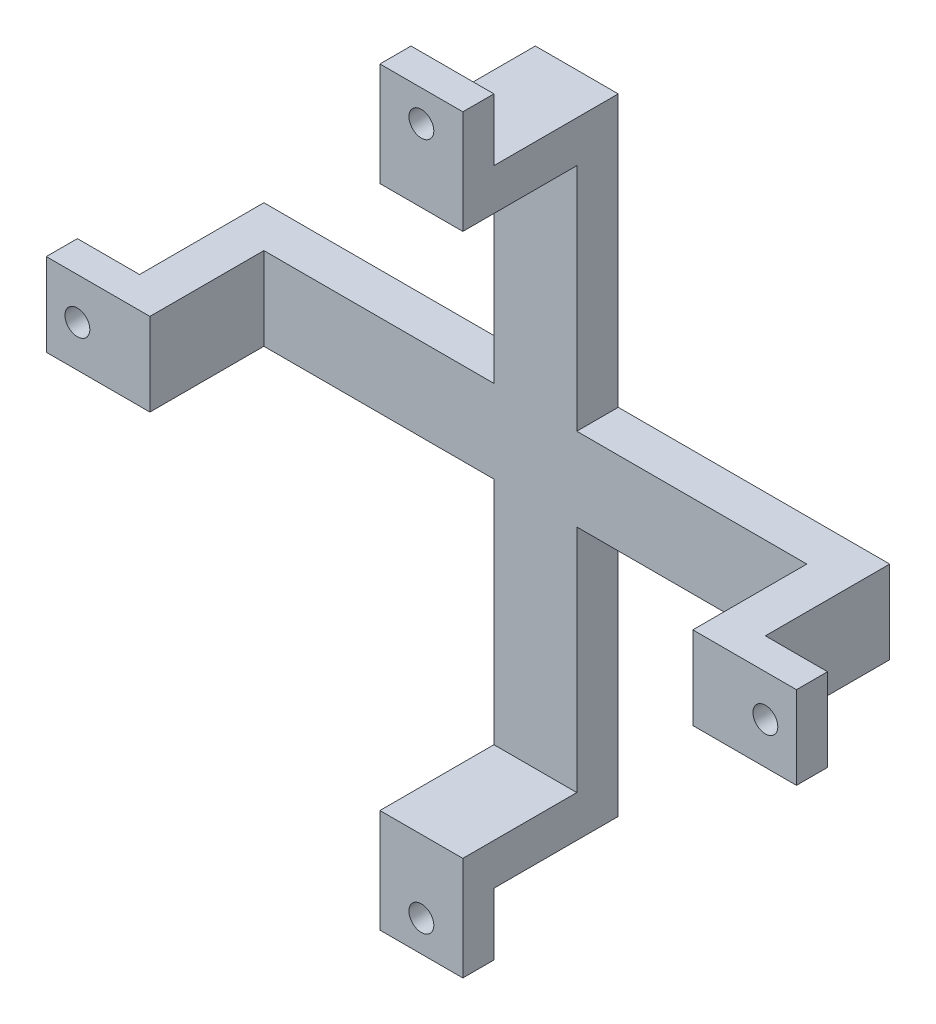
ISO-10303-21;
HEADER;
FILE_DESCRIPTION(('STEP AP214'),'2;1');
FILE_NAME('part.step','',(''),(''),'','','');
FILE_SCHEMA(('AUTOMOTIVE_DESIGN { 1 0 10303 214 1 1 1 1 }'));
ENDSEC;
DATA;
#1=APPLICATION_CONTEXT('core data for automotive mechanical design processes');
#2=APPLICATION_PROTOCOL_DEFINITION('international standard','automotive_design',2000,#1);
#3=PRODUCT_CONTEXT('',#1,'mechanical');
#4=PRODUCT('Part','Part','',(#3));
#5=PRODUCT_RELATED_PRODUCT_CATEGORY('part','',(#4));
#6=PRODUCT_DEFINITION_FORMATION('','',#4);
#7=PRODUCT_DEFINITION_CONTEXT('part definition',#1,'design');
#8=PRODUCT_DEFINITION('design','',#6,#7);
#9=PRODUCT_DEFINITION_SHAPE('','',#8);
#10=(LENGTH_UNIT() NAMED_UNIT(*) SI_UNIT(.MILLI.,.METRE.));
#11=(NAMED_UNIT(*) PLANE_ANGLE_UNIT() SI_UNIT($,.RADIAN.));
#12=(NAMED_UNIT(*) SI_UNIT($,.STERADIAN.) SOLID_ANGLE_UNIT());
#13=UNCERTAINTY_MEASURE_WITH_UNIT(LENGTH_MEASURE(1.E-05),#10,'distance_accuracy_value','');
#14=(GEOMETRIC_REPRESENTATION_CONTEXT(3) GLOBAL_UNCERTAINTY_ASSIGNED_CONTEXT((#13)) GLOBAL_UNIT_ASSIGNED_CONTEXT((#10,
#11,#12)) REPRESENTATION_CONTEXT('',''));
#15=CARTESIAN_POINT('',(0.,0.,0.));
#16=DIRECTION('',(0.,0.,1.));
#17=DIRECTION('',(1.,0.,0.));
#18=AXIS2_PLACEMENT_3D('',#15,#16,#17);
#19=CARTESIAN_POINT('',(-13.1,2.,2.));
#20=DIRECTION('',(0.,1.,0.));
#21=DIRECTION('',(0.,0.,1.));
#22=AXIS2_PLACEMENT_3D('',#19,#20,#21);
#23=PLANE('',#22);
#24=DIRECTION('',(0.,0.,-1.));
#25=VECTOR('',#24,1.);
#26=CARTESIAN_POINT('',(2.,2.,2.));
#27=LINE('',#26,#25);
#28=CARTESIAN_POINT('',(2.,2.,2.));
#29=VERTEX_POINT('',#28);
#30=CARTESIAN_POINT('',(2.,2.,0.));
#31=VERTEX_POINT('',#30);
#32=EDGE_CURVE('E509',#29,#31,#27,.T.);
#33=ORIENTED_EDGE('',*,*,#32,.F.);
#34=DIRECTION('',(1.,0.,0.));
#35=VECTOR('',#34,1.);
#36=CARTESIAN_POINT('',(-13.1,2.,2.));
#37=LINE('',#36,#35);
#38=CARTESIAN_POINT('',(13.1,2.,2.));
#39=VERTEX_POINT('',#38);
#40=EDGE_CURVE('E505',#29,#39,#37,.T.);
#41=ORIENTED_EDGE('',*,*,#40,.T.);
#42=DIRECTION('',(0.,0.,-1.));
#43=VECTOR('',#42,1.);
#44=CARTESIAN_POINT('',(13.1,2.,7.5));
#45=LINE('',#44,#43);
#46=CARTESIAN_POINT('',(13.1,2.,7.5));
#47=VERTEX_POINT('',#46);
#48=EDGE_CURVE('E488',#47,#39,#45,.T.);
#49=ORIENTED_EDGE('',*,*,#48,.F.);
#50=DIRECTION('',(1.,0.,0.));
#51=VECTOR('',#50,1.);
#52=CARTESIAN_POINT('',(0.,2.,7.5));
#53=LINE('',#52,#51);
#54=CARTESIAN_POINT('',(18.1,2.,7.5));
#55=VERTEX_POINT('',#54);
#56=EDGE_CURVE('E475',#47,#55,#53,.T.);
#57=ORIENTED_EDGE('',*,*,#56,.T.);
#58=DIRECTION('',(0.,0.,1.));
#59=VECTOR('',#58,1.);
#60=CARTESIAN_POINT('',(18.1,2.,6.));
#61=LINE('',#60,#59);
#62=CARTESIAN_POINT('',(18.1,2.,6.));
#63=VERTEX_POINT('',#62);
#64=EDGE_CURVE('E365',#63,#55,#61,.T.);
#65=ORIENTED_EDGE('',*,*,#64,.F.);
#66=DIRECTION('',(-1.,0.,0.));
#67=VECTOR('',#66,1.);
#68=CARTESIAN_POINT('',(0.,2.,6.));
#69=LINE('',#68,#67);
#70=CARTESIAN_POINT('',(15.1,2.,6.));
#71=VERTEX_POINT('',#70);
#72=EDGE_CURVE('E354',#63,#71,#69,.T.);
#73=ORIENTED_EDGE('',*,*,#72,.T.);
#74=DIRECTION('',(0.,0.,-1.));
#75=VECTOR('',#74,1.);
#76=CARTESIAN_POINT('',(15.1,2.,7.5));
#77=LINE('',#76,#75);
#78=CARTESIAN_POINT('',(15.1,2.,0.));
#79=VERTEX_POINT('',#78);
#80=EDGE_CURVE('E491',#71,#79,#77,.T.);
#81=ORIENTED_EDGE('',*,*,#80,.T.);
#82=DIRECTION('',(1.,0.,0.));
#83=VECTOR('',#82,1.);
#84=CARTESIAN_POINT('',(-13.1,2.,0.));
#85=LINE('',#84,#83);
#86=EDGE_CURVE('E513',#31,#79,#85,.T.);
#87=ORIENTED_EDGE('',*,*,#86,.F.);
#88=EDGE_LOOP('',(#33,#41,#49,#57,#65,#73,#81,#87));
#89=FACE_BOUND('',#88,.T.);
#90=ADVANCED_FACE('F122',(#89),#23,.T.);
#91=CARTESIAN_POINT('',(-13.1,-2.,2.));
#92=DIRECTION('',(0.,1.,0.));
#93=DIRECTION('',(0.,0.,1.));
#94=AXIS2_PLACEMENT_3D('',#91,#92,#93);
#95=PLANE('',#94);
#96=DIRECTION('',(1.,0.,0.));
#97=VECTOR('',#96,1.);
#98=CARTESIAN_POINT('',(-13.1,-2.,2.));
#99=LINE('',#98,#97);
#100=CARTESIAN_POINT('',(2.,-2.,2.));
#101=VERTEX_POINT('',#100);
#102=CARTESIAN_POINT('',(13.1,-2.,2.));
#103=VERTEX_POINT('',#102);
#104=EDGE_CURVE('E497',#101,#103,#99,.T.);
#105=ORIENTED_EDGE('',*,*,#104,.F.);
#106=DIRECTION('',(0.,0.,-1.));
#107=VECTOR('',#106,1.);
#108=CARTESIAN_POINT('',(2.,-2.,2.));
#109=LINE('',#108,#107);
#110=CARTESIAN_POINT('',(2.,-2.,0.));
#111=VERTEX_POINT('',#110);
#112=EDGE_CURVE('E130',#101,#111,#109,.T.);
#113=ORIENTED_EDGE('',*,*,#112,.T.);
#114=DIRECTION('',(1.,0.,0.));
#115=VECTOR('',#114,1.);
#116=CARTESIAN_POINT('',(-13.1,-2.,0.));
#117=LINE('',#116,#115);
#118=CARTESIAN_POINT('',(15.1,-2.,0.));
#119=VERTEX_POINT('',#118);
#120=EDGE_CURVE('E514',#111,#119,#117,.T.);
#121=ORIENTED_EDGE('',*,*,#120,.T.);
#122=DIRECTION('',(0.,0.,-1.));
#123=VECTOR('',#122,1.);
#124=CARTESIAN_POINT('',(15.1,-2.,7.5));
#125=LINE('',#124,#123);
#126=CARTESIAN_POINT('',(15.1,-2.,6.));
#127=VERTEX_POINT('',#126);
#128=EDGE_CURVE('E481',#127,#119,#125,.T.);
#129=ORIENTED_EDGE('',*,*,#128,.F.);
#130=DIRECTION('',(-1.,0.,0.));
#131=VECTOR('',#130,1.);
#132=CARTESIAN_POINT('',(0.,-2.,6.));
#133=LINE('',#132,#131);
#134=CARTESIAN_POINT('',(18.1,-2.,6.));
#135=VERTEX_POINT('',#134);
#136=EDGE_CURVE('E350',#135,#127,#133,.T.);
#137=ORIENTED_EDGE('',*,*,#136,.F.);
#138=DIRECTION('',(0.,0.,1.));
#139=VECTOR('',#138,1.);
#140=CARTESIAN_POINT('',(18.1,-2.,6.));
#141=LINE('',#140,#139);
#142=CARTESIAN_POINT('',(18.1,-2.,7.5));
#143=VERTEX_POINT('',#142);
#144=EDGE_CURVE('E360',#135,#143,#141,.T.);
#145=ORIENTED_EDGE('',*,*,#144,.T.);
#146=DIRECTION('',(1.,0.,0.));
#147=VECTOR('',#146,1.);
#148=CARTESIAN_POINT('',(0.,-2.,7.5));
#149=LINE('',#148,#147);
#150=CARTESIAN_POINT('',(13.1,-2.,7.5));
#151=VERTEX_POINT('',#150);
#152=EDGE_CURVE('E479',#151,#143,#149,.T.);
#153=ORIENTED_EDGE('',*,*,#152,.F.);
#154=DIRECTION('',(0.,0.,-1.));
#155=VECTOR('',#154,1.);
#156=CARTESIAN_POINT('',(13.1,-2.,7.5));
#157=LINE('',#156,#155);
#158=EDGE_CURVE('E485',#151,#103,#157,.T.);
#159=ORIENTED_EDGE('',*,*,#158,.T.);
#160=EDGE_LOOP('',(#105,#113,#121,#129,#137,#145,#153,#159));
#161=FACE_BOUND('',#160,.T.);
#162=ADVANCED_FACE('F600',(#161),#95,.F.);
#163=CARTESIAN_POINT('',(0.,0.,0.));
#164=DIRECTION('',(0.,0.,1.));
#165=DIRECTION('',(1.,0.,0.));
#166=AXIS2_PLACEMENT_3D('',#163,#164,#165);
#167=PLANE('',#166);
#168=ORIENTED_EDGE('',*,*,#120,.F.);
#169=DIRECTION('',(0.,-1.,0.));
#170=VECTOR('',#169,1.);
#171=CARTESIAN_POINT('',(2.,13.1,0.));
#172=LINE('',#171,#170);
#173=CARTESIAN_POINT('',(2.,-15.1,0.));
#174=VERTEX_POINT('',#173);
#175=EDGE_CURVE('E533',#111,#174,#172,.T.);
#176=ORIENTED_EDGE('',*,*,#175,.T.);
#177=DIRECTION('',(-1.,0.,0.));
#178=VECTOR('',#177,1.);
#179=CARTESIAN_POINT('',(0.,-15.1,0.));
#180=LINE('',#179,#178);
#181=CARTESIAN_POINT('',(-2.,-15.1,0.));
#182=VERTEX_POINT('',#181);
#183=EDGE_CURVE('E441',#174,#182,#180,.T.);
#184=ORIENTED_EDGE('',*,*,#183,.T.);
#185=DIRECTION('',(0.,-1.,0.));
#186=VECTOR('',#185,1.);
#187=CARTESIAN_POINT('',(-2.,13.1,0.));
#188=LINE('',#187,#186);
#189=CARTESIAN_POINT('',(-2.,-2.,0.));
#190=VERTEX_POINT('',#189);
#191=EDGE_CURVE('E493',#190,#182,#188,.T.);
#192=ORIENTED_EDGE('',*,*,#191,.F.);
#193=CARTESIAN_POINT('',(-15.1,-2.,0.));
#194=VERTEX_POINT('',#193);
#195=EDGE_CURVE('E510',#194,#190,#117,.T.);
#196=ORIENTED_EDGE('',*,*,#195,.F.);
#197=DIRECTION('',(0.,1.,0.));
#198=VECTOR('',#197,1.);
#199=CARTESIAN_POINT('',(-15.1,0.,0.));
#200=LINE('',#199,#198);
#201=CARTESIAN_POINT('',(-15.1,2.,0.));
#202=VERTEX_POINT('',#201);
#203=EDGE_CURVE('E422',#194,#202,#200,.T.);
#204=ORIENTED_EDGE('',*,*,#203,.T.);
#205=CARTESIAN_POINT('',(-2.,2.,0.));
#206=VERTEX_POINT('',#205);
#207=EDGE_CURVE('E498',#202,#206,#85,.T.);
#208=ORIENTED_EDGE('',*,*,#207,.T.);
#209=CARTESIAN_POINT('',(-2.,15.1,0.));
#210=VERTEX_POINT('',#209);
#211=EDGE_CURVE('E531',#210,#206,#188,.T.);
#212=ORIENTED_EDGE('',*,*,#211,.F.);
#213=DIRECTION('',(1.,0.,0.));
#214=VECTOR('',#213,1.);
#215=CARTESIAN_POINT('',(0.,15.1,0.));
#216=LINE('',#215,#214);
#217=CARTESIAN_POINT('',(2.,15.1,0.));
#218=VERTEX_POINT('',#217);
#219=EDGE_CURVE('E307',#210,#218,#216,.T.);
#220=ORIENTED_EDGE('',*,*,#219,.T.);
#221=EDGE_CURVE('E534',#218,#31,#172,.T.);
#222=ORIENTED_EDGE('',*,*,#221,.T.);
#223=ORIENTED_EDGE('',*,*,#86,.T.);
#224=DIRECTION('',(0.,-1.,0.));
#225=VECTOR('',#224,1.);
#226=CARTESIAN_POINT('',(15.1,0.,0.));
#227=LINE('',#226,#225);
#228=EDGE_CURVE('E474',#79,#119,#227,.T.);
#229=ORIENTED_EDGE('',*,*,#228,.T.);
#230=EDGE_LOOP('',(#168,#176,#184,#192,#196,#204,#208,#212,#220,#222,#223,#229));
#231=FACE_BOUND('',#230,.T.);
#232=ADVANCED_FACE('F546',(#231),#167,.F.);
#233=CARTESIAN_POINT('',(0.,0.,2.));
#234=DIRECTION('',(0.,0.,1.));
#235=DIRECTION('',(1.,0.,0.));
#236=AXIS2_PLACEMENT_3D('',#233,#234,#235);
#237=PLANE('',#236);
#238=ORIENTED_EDGE('',*,*,#40,.F.);
#239=DIRECTION('',(0.,-1.,0.));
#240=VECTOR('',#239,1.);
#241=CARTESIAN_POINT('',(2.,13.1,2.));
#242=LINE('',#241,#240);
#243=CARTESIAN_POINT('',(2.,13.1,2.));
#244=VERTEX_POINT('',#243);
#245=EDGE_CURVE('E525',#244,#29,#242,.T.);
#246=ORIENTED_EDGE('',*,*,#245,.F.);
#247=DIRECTION('',(1.,0.,0.));
#248=VECTOR('',#247,1.);
#249=CARTESIAN_POINT('',(-2.,13.1,2.));
#250=LINE('',#249,#248);
#251=CARTESIAN_POINT('',(-2.,13.1,2.));
#252=VERTEX_POINT('',#251);
#253=EDGE_CURVE('E528',#252,#244,#250,.T.);
#254=ORIENTED_EDGE('',*,*,#253,.F.);
#255=DIRECTION('',(0.,-1.,0.));
#256=VECTOR('',#255,1.);
#257=CARTESIAN_POINT('',(-2.,13.1,2.));
#258=LINE('',#257,#256);
#259=CARTESIAN_POINT('',(-2.,2.,2.));
#260=VERTEX_POINT('',#259);
#261=EDGE_CURVE('E517',#252,#260,#258,.T.);
#262=ORIENTED_EDGE('',*,*,#261,.T.);
#263=CARTESIAN_POINT('',(-13.1,2.,2.));
#264=VERTEX_POINT('',#263);
#265=EDGE_CURVE('E506',#264,#260,#37,.T.);
#266=ORIENTED_EDGE('',*,*,#265,.F.);
#267=DIRECTION('',(0.,-1.,0.));
#268=VECTOR('',#267,1.);
#269=CARTESIAN_POINT('',(-13.1,2.,2.));
#270=LINE('',#269,#268);
#271=CARTESIAN_POINT('',(-13.1,-2.,2.));
#272=VERTEX_POINT('',#271);
#273=EDGE_CURVE('E494',#264,#272,#270,.T.);
#274=ORIENTED_EDGE('',*,*,#273,.T.);
#275=CARTESIAN_POINT('',(-2.,-2.,2.));
#276=VERTEX_POINT('',#275);
#277=EDGE_CURVE('E499',#272,#276,#99,.T.);
#278=ORIENTED_EDGE('',*,*,#277,.T.);
#279=CARTESIAN_POINT('',(-2.,-13.1,2.));
#280=VERTEX_POINT('',#279);
#281=EDGE_CURVE('E521',#276,#280,#258,.T.);
#282=ORIENTED_EDGE('',*,*,#281,.T.);
#283=DIRECTION('',(1.,0.,0.));
#284=VECTOR('',#283,1.);
#285=CARTESIAN_POINT('',(-2.,-13.1,2.));
#286=LINE('',#285,#284);
#287=CARTESIAN_POINT('',(2.,-13.1,2.));
#288=VERTEX_POINT('',#287);
#289=EDGE_CURVE('E520',#280,#288,#286,.T.);
#290=ORIENTED_EDGE('',*,*,#289,.T.);
#291=EDGE_CURVE('E524',#101,#288,#242,.T.);
#292=ORIENTED_EDGE('',*,*,#291,.F.);
#293=ORIENTED_EDGE('',*,*,#104,.T.);
#294=DIRECTION('',(0.,-1.,0.));
#295=VECTOR('',#294,1.);
#296=CARTESIAN_POINT('',(13.1,2.,2.));
#297=LINE('',#296,#295);
#298=EDGE_CURVE('E502',#39,#103,#297,.T.);
#299=ORIENTED_EDGE('',*,*,#298,.F.);
#300=EDGE_LOOP('',(#238,#246,#254,#262,#266,#274,#278,#282,#290,#292,#293,#299));
#301=FACE_BOUND('',#300,.T.);
#302=ADVANCED_FACE('F571',(#301),#237,.T.);
#303=ORIENTED_EDGE('',*,*,#265,.T.);
#304=DIRECTION('',(0.,0.,-1.));
#305=VECTOR('',#304,1.);
#306=CARTESIAN_POINT('',(-2.,2.,2.));
#307=LINE('',#306,#305);
#308=EDGE_CURVE('E538',#260,#206,#307,.T.);
#309=ORIENTED_EDGE('',*,*,#308,.T.);
#310=ORIENTED_EDGE('',*,*,#207,.F.);
#311=DIRECTION('',(0.,0.,-1.));
#312=VECTOR('',#311,1.);
#313=CARTESIAN_POINT('',(-15.1,2.,7.5));
#314=LINE('',#313,#312);
#315=CARTESIAN_POINT('',(-15.1,2.,6.));
#316=VERTEX_POINT('',#315);
#317=EDGE_CURVE('E430',#316,#202,#314,.T.);
#318=ORIENTED_EDGE('',*,*,#317,.F.);
#319=DIRECTION('',(1.,0.,0.));
#320=VECTOR('',#319,1.);
#321=CARTESIAN_POINT('',(0.,1.99999999999999,6.));
#322=LINE('',#321,#320);
#323=CARTESIAN_POINT('',(-18.1,2.,6.));
#324=VERTEX_POINT('',#323);
#325=EDGE_CURVE('E402',#324,#316,#322,.T.);
#326=ORIENTED_EDGE('',*,*,#325,.F.);
#327=DIRECTION('',(0.,0.,1.));
#328=VECTOR('',#327,1.);
#329=CARTESIAN_POINT('',(-18.1,2.,6.));
#330=LINE('',#329,#328);
#331=CARTESIAN_POINT('',(-18.1,2.,7.5));
#332=VERTEX_POINT('',#331);
#333=EDGE_CURVE('E414',#324,#332,#330,.T.);
#334=ORIENTED_EDGE('',*,*,#333,.T.);
#335=DIRECTION('',(-1.,0.,0.));
#336=VECTOR('',#335,1.);
#337=CARTESIAN_POINT('',(0.,2.00000000000002,7.5));
#338=LINE('',#337,#336);
#339=CARTESIAN_POINT('',(-13.1,2.,7.5));
#340=VERTEX_POINT('',#339);
#341=EDGE_CURVE('E428',#340,#332,#338,.T.);
#342=ORIENTED_EDGE('',*,*,#341,.F.);
#343=DIRECTION('',(0.,0.,-1.));
#344=VECTOR('',#343,1.);
#345=CARTESIAN_POINT('',(-13.1,2.,7.5));
#346=LINE('',#345,#344);
#347=EDGE_CURVE('E434',#340,#264,#346,.T.);
#348=ORIENTED_EDGE('',*,*,#347,.T.);
#349=EDGE_LOOP('',(#303,#309,#310,#318,#326,#334,#342,#348));
#350=FACE_BOUND('',#349,.T.);
#351=ADVANCED_FACE('F541',(#350),#23,.T.);
#352=DIRECTION('',(0.,0.,-1.));
#353=VECTOR('',#352,1.);
#354=CARTESIAN_POINT('',(-2.,-2.,2.));
#355=LINE('',#354,#353);
#356=EDGE_CURVE('E12',#276,#190,#355,.T.);
#357=ORIENTED_EDGE('',*,*,#356,.F.);
#358=ORIENTED_EDGE('',*,*,#277,.F.);
#359=DIRECTION('',(0.,0.,-1.));
#360=VECTOR('',#359,1.);
#361=CARTESIAN_POINT('',(-13.1,-2.,7.5));
#362=LINE('',#361,#360);
#363=CARTESIAN_POINT('',(-13.1,-2.,7.5));
#364=VERTEX_POINT('',#363);
#365=EDGE_CURVE('E437',#364,#272,#362,.T.);
#366=ORIENTED_EDGE('',*,*,#365,.F.);
#367=DIRECTION('',(-1.,0.,0.));
#368=VECTOR('',#367,1.);
#369=CARTESIAN_POINT('',(0.,-2.00000000000002,7.5));
#370=LINE('',#369,#368);
#371=CARTESIAN_POINT('',(-18.1,-2.,7.5));
#372=VERTEX_POINT('',#371);
#373=EDGE_CURVE('E423',#364,#372,#370,.T.);
#374=ORIENTED_EDGE('',*,*,#373,.T.);
#375=DIRECTION('',(0.,0.,1.));
#376=VECTOR('',#375,1.);
#377=CARTESIAN_POINT('',(-18.1,-2.,6.));
#378=LINE('',#377,#376);
#379=CARTESIAN_POINT('',(-18.1,-2.,6.));
#380=VERTEX_POINT('',#379);
#381=EDGE_CURVE('E419',#380,#372,#378,.T.);
#382=ORIENTED_EDGE('',*,*,#381,.F.);
#383=DIRECTION('',(1.,0.,0.));
#384=VECTOR('',#383,1.);
#385=CARTESIAN_POINT('',(0.,-1.99999999999999,6.));
#386=LINE('',#385,#384);
#387=CARTESIAN_POINT('',(-15.1,-2.,6.));
#388=VERTEX_POINT('',#387);
#389=EDGE_CURVE('E408',#380,#388,#386,.T.);
#390=ORIENTED_EDGE('',*,*,#389,.T.);
#391=DIRECTION('',(0.,0.,-1.));
#392=VECTOR('',#391,1.);
#393=CARTESIAN_POINT('',(-15.1,-2.,7.5));
#394=LINE('',#393,#392);
#395=EDGE_CURVE('E439',#388,#194,#394,.T.);
#396=ORIENTED_EDGE('',*,*,#395,.T.);
#397=ORIENTED_EDGE('',*,*,#195,.T.);
#398=EDGE_LOOP('',(#357,#358,#366,#374,#382,#390,#396,#397));
#399=FACE_BOUND('',#398,.T.);
#400=ADVANCED_FACE('F617',(#399),#95,.F.);
#401=CARTESIAN_POINT('',(2.,13.1,2.));
#402=DIRECTION('',(1.,0.,0.));
#403=DIRECTION('',(0.,1.,0.));
#404=AXIS2_PLACEMENT_3D('',#401,#402,#403);
#405=PLANE('',#404);
#406=ORIENTED_EDGE('',*,*,#245,.T.);
#407=ORIENTED_EDGE('',*,*,#32,.T.);
#408=ORIENTED_EDGE('',*,*,#221,.F.);
#409=DIRECTION('',(0.,0.,-1.));
#410=VECTOR('',#409,1.);
#411=CARTESIAN_POINT('',(2.,15.1,7.5));
#412=LINE('',#411,#410);
#413=CARTESIAN_POINT('',(2.,15.1,6.));
#414=VERTEX_POINT('',#413);
#415=EDGE_CURVE('E312',#414,#218,#412,.T.);
#416=ORIENTED_EDGE('',*,*,#415,.F.);
#417=DIRECTION('',(0.,-1.,0.));
#418=VECTOR('',#417,1.);
#419=CARTESIAN_POINT('',(2.,0.,6.));
#420=LINE('',#419,#418);
#421=CARTESIAN_POINT('',(2.,18.1,6.));
#422=VERTEX_POINT('',#421);
#423=EDGE_CURVE('E323',#422,#414,#420,.T.);
#424=ORIENTED_EDGE('',*,*,#423,.F.);
#425=DIRECTION('',(0.,0.,1.));
#426=VECTOR('',#425,1.);
#427=CARTESIAN_POINT('',(2.,18.1,6.));
#428=LINE('',#427,#426);
#429=CARTESIAN_POINT('',(2.,18.1,7.5));
#430=VERTEX_POINT('',#429);
#431=EDGE_CURVE('E338',#422,#430,#428,.T.);
#432=ORIENTED_EDGE('',*,*,#431,.T.);
#433=DIRECTION('',(0.,1.,0.));
#434=VECTOR('',#433,1.);
#435=CARTESIAN_POINT('',(2.,0.,7.5));
#436=LINE('',#435,#434);
#437=CARTESIAN_POINT('',(2.,13.1,7.5));
#438=VERTEX_POINT('',#437);
#439=EDGE_CURVE('E463',#438,#430,#436,.T.);
#440=ORIENTED_EDGE('',*,*,#439,.F.);
#441=DIRECTION('',(0.,0.,-1.));
#442=VECTOR('',#441,1.);
#443=CARTESIAN_POINT('',(2.,13.1,7.5));
#444=LINE('',#443,#442);
#445=EDGE_CURVE('E471',#438,#244,#444,.T.);
#446=ORIENTED_EDGE('',*,*,#445,.T.);
#447=EDGE_LOOP('',(#406,#407,#408,#416,#424,#432,#440,#446));
#448=FACE_BOUND('',#447,.T.);
#449=ADVANCED_FACE('F586',(#448),#405,.T.);
#450=CARTESIAN_POINT('',(-2.,13.1,2.));
#451=DIRECTION('',(1.,0.,0.));
#452=DIRECTION('',(0.,1.,0.));
#453=AXIS2_PLACEMENT_3D('',#450,#451,#452);
#454=PLANE('',#453);
#455=ORIENTED_EDGE('',*,*,#308,.F.);
#456=ORIENTED_EDGE('',*,*,#261,.F.);
#457=DIRECTION('',(0.,0.,-1.));
#458=VECTOR('',#457,1.);
#459=CARTESIAN_POINT('',(-2.,13.1,7.5));
#460=LINE('',#459,#458);
#461=CARTESIAN_POINT('',(-2.,13.1,7.5));
#462=VERTEX_POINT('',#461);
#463=EDGE_CURVE('E313',#462,#252,#460,.T.);
#464=ORIENTED_EDGE('',*,*,#463,.F.);
#465=DIRECTION('',(0.,1.,0.));
#466=VECTOR('',#465,1.);
#467=CARTESIAN_POINT('',(-2.,0.,7.5));
#468=LINE('',#467,#466);
#469=CARTESIAN_POINT('',(-2.,18.1,7.5));
#470=VERTEX_POINT('',#469);
#471=EDGE_CURVE('E465',#462,#470,#468,.T.);
#472=ORIENTED_EDGE('',*,*,#471,.T.);
#473=DIRECTION('',(0.,0.,1.));
#474=VECTOR('',#473,1.);
#475=CARTESIAN_POINT('',(-2.,18.1,6.));
#476=LINE('',#475,#474);
#477=CARTESIAN_POINT('',(-2.,18.1,6.));
#478=VERTEX_POINT('',#477);
#479=EDGE_CURVE('E326',#478,#470,#476,.T.);
#480=ORIENTED_EDGE('',*,*,#479,.F.);
#481=DIRECTION('',(0.,-1.,0.));
#482=VECTOR('',#481,1.);
#483=CARTESIAN_POINT('',(-2.,0.,6.));
#484=LINE('',#483,#482);
#485=CARTESIAN_POINT('',(-2.,15.1,6.));
#486=VERTEX_POINT('',#485);
#487=EDGE_CURVE('E320',#478,#486,#484,.T.);
#488=ORIENTED_EDGE('',*,*,#487,.T.);
#489=DIRECTION('',(0.,0.,-1.));
#490=VECTOR('',#489,1.);
#491=CARTESIAN_POINT('',(-2.,15.1,7.5));
#492=LINE('',#491,#490);
#493=EDGE_CURVE('E304',#486,#210,#492,.T.);
#494=ORIENTED_EDGE('',*,*,#493,.T.);
#495=ORIENTED_EDGE('',*,*,#211,.T.);
#496=EDGE_LOOP('',(#455,#456,#464,#472,#480,#488,#494,#495));
#497=FACE_BOUND('',#496,.T.);
#498=ADVANCED_FACE('F124',(#497),#454,.F.);
#499=ORIENTED_EDGE('',*,*,#112,.F.);
#500=ORIENTED_EDGE('',*,*,#291,.T.);
#501=DIRECTION('',(0.,0.,-1.));
#502=VECTOR('',#501,1.);
#503=CARTESIAN_POINT('',(2.,-13.1,7.5));
#504=LINE('',#503,#502);
#505=CARTESIAN_POINT('',(2.,-13.1,7.5));
#506=VERTEX_POINT('',#505);
#507=EDGE_CURVE('E449',#506,#288,#504,.T.);
#508=ORIENTED_EDGE('',*,*,#507,.F.);
#509=DIRECTION('',(0.,-1.,0.));
#510=VECTOR('',#509,1.);
#511=CARTESIAN_POINT('',(2.,0.,7.5));
#512=LINE('',#511,#510);
#513=CARTESIAN_POINT('',(2.,-18.1,7.5));
#514=VERTEX_POINT('',#513);
#515=EDGE_CURVE('E447',#506,#514,#512,.T.);
#516=ORIENTED_EDGE('',*,*,#515,.T.);
#517=DIRECTION('',(0.,0.,1.));
#518=VECTOR('',#517,1.);
#519=CARTESIAN_POINT('',(2.,-18.1,6.));
#520=LINE('',#519,#518);
#521=CARTESIAN_POINT('',(2.,-18.1,6.));
#522=VERTEX_POINT('',#521);
#523=EDGE_CURVE('E390',#522,#514,#520,.T.);
#524=ORIENTED_EDGE('',*,*,#523,.F.);
#525=DIRECTION('',(0.,1.,0.));
#526=VECTOR('',#525,1.);
#527=CARTESIAN_POINT('',(2.,0.,6.));
#528=LINE('',#527,#526);
#529=CARTESIAN_POINT('',(2.,-15.1,6.));
#530=VERTEX_POINT('',#529);
#531=EDGE_CURVE('E375',#522,#530,#528,.T.);
#532=ORIENTED_EDGE('',*,*,#531,.T.);
#533=DIRECTION('',(0.,0.,-1.));
#534=VECTOR('',#533,1.);
#535=CARTESIAN_POINT('',(2.,-15.1,7.5));
#536=LINE('',#535,#534);
#537=EDGE_CURVE('E453',#530,#174,#536,.T.);
#538=ORIENTED_EDGE('',*,*,#537,.T.);
#539=ORIENTED_EDGE('',*,*,#175,.F.);
#540=EDGE_LOOP('',(#499,#500,#508,#516,#524,#532,#538,#539));
#541=FACE_BOUND('',#540,.T.);
#542=ADVANCED_FACE('F625',(#541),#405,.T.);
#543=ORIENTED_EDGE('',*,*,#281,.F.);
#544=ORIENTED_EDGE('',*,*,#356,.T.);
#545=ORIENTED_EDGE('',*,*,#191,.T.);
#546=DIRECTION('',(0.,0.,-1.));
#547=VECTOR('',#546,1.);
#548=CARTESIAN_POINT('',(-2.,-15.1,7.5));
#549=LINE('',#548,#547);
#550=CARTESIAN_POINT('',(-2.,-15.1,6.));
#551=VERTEX_POINT('',#550);
#552=EDGE_CURVE('E455',#551,#182,#549,.T.);
#553=ORIENTED_EDGE('',*,*,#552,.F.);
#554=DIRECTION('',(0.,1.,0.));
#555=VECTOR('',#554,1.);
#556=CARTESIAN_POINT('',(-2.,0.,6.));
#557=LINE('',#556,#555);
#558=CARTESIAN_POINT('',(-2.,-18.1,6.));
#559=VERTEX_POINT('',#558);
#560=EDGE_CURVE('E381',#559,#551,#557,.T.);
#561=ORIENTED_EDGE('',*,*,#560,.F.);
#562=DIRECTION('',(0.,0.,1.));
#563=VECTOR('',#562,1.);
#564=CARTESIAN_POINT('',(-2.,-18.1,6.));
#565=LINE('',#564,#563);
#566=CARTESIAN_POINT('',(-2.,-18.1,7.5));
#567=VERTEX_POINT('',#566);
#568=EDGE_CURVE('E387',#559,#567,#565,.T.);
#569=ORIENTED_EDGE('',*,*,#568,.T.);
#570=DIRECTION('',(0.,-1.,0.));
#571=VECTOR('',#570,1.);
#572=CARTESIAN_POINT('',(-2.,0.,7.5));
#573=LINE('',#572,#571);
#574=CARTESIAN_POINT('',(-2.,-13.1,7.5));
#575=VERTEX_POINT('',#574);
#576=EDGE_CURVE('E445',#575,#567,#573,.T.);
#577=ORIENTED_EDGE('',*,*,#576,.F.);
#578=DIRECTION('',(0.,0.,-1.));
#579=VECTOR('',#578,1.);
#580=CARTESIAN_POINT('',(-2.,-13.1,7.5));
#581=LINE('',#580,#579);
#582=EDGE_CURVE('E457',#575,#280,#581,.T.);
#583=ORIENTED_EDGE('',*,*,#582,.T.);
#584=EDGE_LOOP('',(#543,#544,#545,#553,#561,#569,#577,#583));
#585=FACE_BOUND('',#584,.T.);
#586=ADVANCED_FACE('F615',(#585),#454,.F.);
#587=CARTESIAN_POINT('',(13.1,0.,7.5));
#588=DIRECTION('',(1.,0.,0.));
#589=DIRECTION('',(0.,0.,-1.));
#590=AXIS2_PLACEMENT_3D('',#587,#588,#589);
#591=PLANE('',#590);
#592=ORIENTED_EDGE('',*,*,#48,.T.);
#593=ORIENTED_EDGE('',*,*,#298,.T.);
#594=ORIENTED_EDGE('',*,*,#158,.F.);
#595=DIRECTION('',(0.,-1.,0.));
#596=VECTOR('',#595,1.);
#597=CARTESIAN_POINT('',(13.1,0.,7.5));
#598=LINE('',#597,#596);
#599=EDGE_CURVE('E477',#47,#151,#598,.T.);
#600=ORIENTED_EDGE('',*,*,#599,.F.);
#601=EDGE_LOOP('',(#592,#593,#594,#600));
#602=FACE_BOUND('',#601,.T.);
#603=ADVANCED_FACE('F627',(#602),#591,.F.);
#604=CARTESIAN_POINT('',(15.1,0.,7.5));
#605=DIRECTION('',(1.,0.,0.));
#606=DIRECTION('',(0.,0.,-1.));
#607=AXIS2_PLACEMENT_3D('',#604,#605,#606);
#608=PLANE('',#607);
#609=DIRECTION('',(0.,1.,0.));
#610=VECTOR('',#609,1.);
#611=CARTESIAN_POINT('',(15.1,0.,6.));
#612=LINE('',#611,#610);
#613=EDGE_CURVE('E145',#127,#71,#612,.T.);
#614=ORIENTED_EDGE('',*,*,#613,.F.);
#615=ORIENTED_EDGE('',*,*,#128,.T.);
#616=ORIENTED_EDGE('',*,*,#228,.F.);
#617=ORIENTED_EDGE('',*,*,#80,.F.);
#618=EDGE_LOOP('',(#614,#615,#616,#617));
#619=FACE_BOUND('',#618,.T.);
#620=ADVANCED_FACE('F593',(#619),#608,.T.);
#621=CARTESIAN_POINT('',(0.,0.,7.5));
#622=DIRECTION('',(0.,0.,1.));
#623=DIRECTION('',(1.,0.,0.));
#624=AXIS2_PLACEMENT_3D('',#621,#622,#623);
#625=PLANE('',#624);
#626=ORIENTED_EDGE('',*,*,#152,.T.);
#627=DIRECTION('',(0.,1.,0.));
#628=VECTOR('',#627,1.);
#629=CARTESIAN_POINT('',(18.1,0.,7.5));
#630=LINE('',#629,#628);
#631=EDGE_CURVE('E347',#143,#55,#630,.T.);
#632=ORIENTED_EDGE('',*,*,#631,.T.);
#633=ORIENTED_EDGE('',*,*,#56,.F.);
#634=ORIENTED_EDGE('',*,*,#599,.T.);
#635=EDGE_LOOP('',(#626,#632,#633,#634));
#636=FACE_BOUND('',#635,.T.);
#637=CARTESIAN_POINT('',(16.6,0.,7.5));
#638=DIRECTION('',(0.,0.,1.));
#639=DIRECTION('',(1.,0.,0.));
#640=AXIS2_PLACEMENT_3D('',#637,#638,#639);
#641=CIRCLE('',#640,0.6);
#642=CARTESIAN_POINT('',(17.2,0.,7.5));
#643=VERTEX_POINT('',#642);
#644=EDGE_CURVE('E341',#643,#643,#641,.T.);
#645=ORIENTED_EDGE('',*,*,#644,.F.);
#646=EDGE_LOOP('',(#645));
#647=FACE_BOUND('',#646,.T.);
#648=ADVANCED_FACE('F654',(#636,#647),#625,.T.);
#649=CARTESIAN_POINT('',(0.,13.1,7.5));
#650=DIRECTION('',(0.,1.,0.));
#651=DIRECTION('',(0.,0.,1.));
#652=AXIS2_PLACEMENT_3D('',#649,#650,#651);
#653=PLANE('',#652);
#654=ORIENTED_EDGE('',*,*,#463,.T.);
#655=ORIENTED_EDGE('',*,*,#253,.T.);
#656=ORIENTED_EDGE('',*,*,#445,.F.);
#657=DIRECTION('',(1.,0.,0.));
#658=VECTOR('',#657,1.);
#659=CARTESIAN_POINT('',(0.,13.1,7.5));
#660=LINE('',#659,#658);
#661=EDGE_CURVE('E460',#462,#438,#660,.T.);
#662=ORIENTED_EDGE('',*,*,#661,.F.);
#663=EDGE_LOOP('',(#654,#655,#656,#662));
#664=FACE_BOUND('',#663,.T.);
#665=ADVANCED_FACE('F578',(#664),#653,.F.);
#666=CARTESIAN_POINT('',(0.,15.1,7.5));
#667=DIRECTION('',(0.,1.,0.));
#668=DIRECTION('',(0.,0.,1.));
#669=AXIS2_PLACEMENT_3D('',#666,#667,#668);
#670=PLANE('',#669);
#671=DIRECTION('',(-1.,0.,0.));
#672=VECTOR('',#671,1.);
#673=CARTESIAN_POINT('',(0.,15.1,6.));
#674=LINE('',#673,#672);
#675=EDGE_CURVE('E137',#414,#486,#674,.T.);
#676=ORIENTED_EDGE('',*,*,#675,.F.);
#677=ORIENTED_EDGE('',*,*,#415,.T.);
#678=ORIENTED_EDGE('',*,*,#219,.F.);
#679=ORIENTED_EDGE('',*,*,#493,.F.);
#680=EDGE_LOOP('',(#676,#677,#678,#679));
#681=FACE_BOUND('',#680,.T.);
#682=ADVANCED_FACE('F305',(#681),#670,.T.);
#683=CARTESIAN_POINT('',(0.,0.,7.5));
#684=DIRECTION('',(0.,0.,1.));
#685=DIRECTION('',(1.,0.,0.));
#686=AXIS2_PLACEMENT_3D('',#683,#684,#685);
#687=PLANE('',#686);
#688=ORIENTED_EDGE('',*,*,#661,.T.);
#689=ORIENTED_EDGE('',*,*,#439,.T.);
#690=DIRECTION('',(-1.,0.,0.));
#691=VECTOR('',#690,1.);
#692=CARTESIAN_POINT('',(0.,18.1,7.5));
#693=LINE('',#692,#691);
#694=EDGE_CURVE('E327',#430,#470,#693,.T.);
#695=ORIENTED_EDGE('',*,*,#694,.T.);
#696=ORIENTED_EDGE('',*,*,#471,.F.);
#697=EDGE_LOOP('',(#688,#689,#695,#696));
#698=FACE_BOUND('',#697,.T.);
#699=CARTESIAN_POINT('',(0.,16.6,7.5));
#700=DIRECTION('',(0.,0.,1.));
#701=DIRECTION('',(1.,0.,0.));
#702=AXIS2_PLACEMENT_3D('',#699,#700,#701);
#703=CIRCLE('',#702,0.6);
#704=CARTESIAN_POINT('',(0.6,16.6,7.5));
#705=VERTEX_POINT('',#704);
#706=EDGE_CURVE('E333',#705,#705,#703,.T.);
#707=ORIENTED_EDGE('',*,*,#706,.F.);
#708=EDGE_LOOP('',(#707));
#709=FACE_BOUND('',#708,.T.);
#710=ADVANCED_FACE('F580',(#698,#709),#687,.T.);
#711=CARTESIAN_POINT('',(0.,-13.1,7.5));
#712=DIRECTION('',(0.,1.,0.));
#713=DIRECTION('',(0.,0.,1.));
#714=AXIS2_PLACEMENT_3D('',#711,#712,#713);
#715=PLANE('',#714);
#716=ORIENTED_EDGE('',*,*,#289,.F.);
#717=ORIENTED_EDGE('',*,*,#582,.F.);
#718=DIRECTION('',(1.,0.,0.));
#719=VECTOR('',#718,1.);
#720=CARTESIAN_POINT('',(0.,-13.1,7.5));
#721=LINE('',#720,#719);
#722=EDGE_CURVE('E442',#575,#506,#721,.T.);
#723=ORIENTED_EDGE('',*,*,#722,.T.);
#724=ORIENTED_EDGE('',*,*,#507,.T.);
#725=EDGE_LOOP('',(#716,#717,#723,#724));
#726=FACE_BOUND('',#725,.T.);
#727=ADVANCED_FACE('F622',(#726),#715,.T.);
#728=CARTESIAN_POINT('',(0.,-15.1,7.5));
#729=DIRECTION('',(0.,-1.,0.));
#730=DIRECTION('',(0.,0.,-1.));
#731=AXIS2_PLACEMENT_3D('',#728,#729,#730);
#732=PLANE('',#731);
#733=DIRECTION('',(1.,0.,0.));
#734=VECTOR('',#733,1.);
#735=CARTESIAN_POINT('',(0.,-15.1,6.));
#736=LINE('',#735,#734);
#737=EDGE_CURVE('E378',#551,#530,#736,.T.);
#738=ORIENTED_EDGE('',*,*,#737,.F.);
#739=ORIENTED_EDGE('',*,*,#552,.T.);
#740=ORIENTED_EDGE('',*,*,#183,.F.);
#741=ORIENTED_EDGE('',*,*,#537,.F.);
#742=EDGE_LOOP('',(#738,#739,#740,#741));
#743=FACE_BOUND('',#742,.T.);
#744=ADVANCED_FACE('F609',(#743),#732,.T.);
#745=CARTESIAN_POINT('',(0.,0.,7.5));
#746=DIRECTION('',(0.,0.,1.));
#747=DIRECTION('',(1.,0.,0.));
#748=AXIS2_PLACEMENT_3D('',#745,#746,#747);
#749=PLANE('',#748);
#750=ORIENTED_EDGE('',*,*,#722,.F.);
#751=ORIENTED_EDGE('',*,*,#576,.T.);
#752=DIRECTION('',(1.,0.,0.));
#753=VECTOR('',#752,1.);
#754=CARTESIAN_POINT('',(0.,-18.1,7.5));
#755=LINE('',#754,#753);
#756=EDGE_CURVE('E372',#567,#514,#755,.T.);
#757=ORIENTED_EDGE('',*,*,#756,.T.);
#758=ORIENTED_EDGE('',*,*,#515,.F.);
#759=EDGE_LOOP('',(#750,#751,#757,#758));
#760=FACE_BOUND('',#759,.T.);
#761=CARTESIAN_POINT('',(0.,-16.6,7.5));
#762=DIRECTION('',(0.,0.,1.));
#763=DIRECTION('',(1.,0.,0.));
#764=AXIS2_PLACEMENT_3D('',#761,#762,#763);
#765=CIRCLE('',#764,0.6);
#766=CARTESIAN_POINT('',(0.6,-16.6,7.5));
#767=VERTEX_POINT('',#766);
#768=EDGE_CURVE('E368',#767,#767,#765,.T.);
#769=ORIENTED_EDGE('',*,*,#768,.F.);
#770=EDGE_LOOP('',(#769));
#771=FACE_BOUND('',#770,.T.);
#772=ADVANCED_FACE('F669',(#760,#771),#749,.T.);
#773=CARTESIAN_POINT('',(-13.1,0.,7.5));
#774=DIRECTION('',(1.,0.,0.));
#775=DIRECTION('',(0.,0.,-1.));
#776=AXIS2_PLACEMENT_3D('',#773,#774,#775);
#777=PLANE('',#776);
#778=ORIENTED_EDGE('',*,*,#273,.F.);
#779=ORIENTED_EDGE('',*,*,#347,.F.);
#780=DIRECTION('',(0.,-1.,0.));
#781=VECTOR('',#780,1.);
#782=CARTESIAN_POINT('',(-13.1,0.,7.5));
#783=LINE('',#782,#781);
#784=EDGE_CURVE('E425',#340,#364,#783,.T.);
#785=ORIENTED_EDGE('',*,*,#784,.T.);
#786=ORIENTED_EDGE('',*,*,#365,.T.);
#787=EDGE_LOOP('',(#778,#779,#785,#786));
#788=FACE_BOUND('',#787,.T.);
#789=ADVANCED_FACE('F567',(#788),#777,.T.);
#790=CARTESIAN_POINT('',(-15.1,0.,7.5));
#791=DIRECTION('',(-1.,0.,0.));
#792=DIRECTION('',(0.,0.,1.));
#793=AXIS2_PLACEMENT_3D('',#790,#791,#792);
#794=PLANE('',#793);
#795=DIRECTION('',(0.,-1.,0.));
#796=VECTOR('',#795,1.);
#797=CARTESIAN_POINT('',(-15.1,0.,6.));
#798=LINE('',#797,#796);
#799=EDGE_CURVE('E405',#316,#388,#798,.T.);
#800=ORIENTED_EDGE('',*,*,#799,.F.);
#801=ORIENTED_EDGE('',*,*,#317,.T.);
#802=ORIENTED_EDGE('',*,*,#203,.F.);
#803=ORIENTED_EDGE('',*,*,#395,.F.);
#804=EDGE_LOOP('',(#800,#801,#802,#803));
#805=FACE_BOUND('',#804,.T.);
#806=ADVANCED_FACE('F551',(#805),#794,.T.);
#807=CARTESIAN_POINT('',(0.,0.,7.5));
#808=DIRECTION('',(0.,0.,1.));
#809=DIRECTION('',(1.,0.,0.));
#810=AXIS2_PLACEMENT_3D('',#807,#808,#809);
#811=PLANE('',#810);
#812=ORIENTED_EDGE('',*,*,#341,.T.);
#813=DIRECTION('',(0.,-1.,0.));
#814=VECTOR('',#813,1.);
#815=CARTESIAN_POINT('',(-18.1,0.,7.5));
#816=LINE('',#815,#814);
#817=EDGE_CURVE('E399',#332,#372,#816,.T.);
#818=ORIENTED_EDGE('',*,*,#817,.T.);
#819=ORIENTED_EDGE('',*,*,#373,.F.);
#820=ORIENTED_EDGE('',*,*,#784,.F.);
#821=EDGE_LOOP('',(#812,#818,#819,#820));
#822=FACE_BOUND('',#821,.T.);
#823=CARTESIAN_POINT('',(-16.6,0.,7.5));
#824=DIRECTION('',(0.,0.,1.));
#825=DIRECTION('',(1.,0.,0.));
#826=AXIS2_PLACEMENT_3D('',#823,#824,#825);
#827=CIRCLE('',#826,0.6);
#828=CARTESIAN_POINT('',(-16.,0.,7.5));
#829=VERTEX_POINT('',#828);
#830=EDGE_CURVE('E393',#829,#829,#827,.T.);
#831=ORIENTED_EDGE('',*,*,#830,.F.);
#832=EDGE_LOOP('',(#831));
#833=FACE_BOUND('',#832,.T.);
#834=ADVANCED_FACE('F564',(#822,#833),#811,.T.);
#835=CARTESIAN_POINT('',(-18.1,0.,6.));
#836=DIRECTION('',(-1.,0.,0.));
#837=DIRECTION('',(0.,0.,1.));
#838=AXIS2_PLACEMENT_3D('',#835,#836,#837);
#839=PLANE('',#838);
#840=ORIENTED_EDGE('',*,*,#817,.F.);
#841=ORIENTED_EDGE('',*,*,#333,.F.);
#842=DIRECTION('',(0.,-1.,0.));
#843=VECTOR('',#842,1.);
#844=CARTESIAN_POINT('',(-18.1,0.,6.));
#845=LINE('',#844,#843);
#846=EDGE_CURVE('E411',#324,#380,#845,.T.);
#847=ORIENTED_EDGE('',*,*,#846,.T.);
#848=ORIENTED_EDGE('',*,*,#381,.T.);
#849=EDGE_LOOP('',(#840,#841,#847,#848));
#850=FACE_BOUND('',#849,.T.);
#851=ADVANCED_FACE('F559',(#850),#839,.T.);
#852=CARTESIAN_POINT('',(0.,0.,6.));
#853=DIRECTION('',(0.,0.,-1.));
#854=DIRECTION('',(-1.,0.,0.));
#855=AXIS2_PLACEMENT_3D('',#852,#853,#854);
#856=PLANE('',#855);
#857=CARTESIAN_POINT('',(-16.6,0.,6.));
#858=DIRECTION('',(0.,0.,1.));
#859=DIRECTION('',(1.,0.,0.));
#860=AXIS2_PLACEMENT_3D('',#857,#858,#859);
#861=CIRCLE('',#860,0.6);
#862=CARTESIAN_POINT('',(-16.,0.,6.));
#863=VERTEX_POINT('',#862);
#864=EDGE_CURVE('E396',#863,#863,#861,.T.);
#865=ORIENTED_EDGE('',*,*,#864,.T.);
#866=EDGE_LOOP('',(#865));
#867=FACE_BOUND('',#866,.T.);
#868=ORIENTED_EDGE('',*,*,#325,.T.);
#869=ORIENTED_EDGE('',*,*,#799,.T.);
#870=ORIENTED_EDGE('',*,*,#389,.F.);
#871=ORIENTED_EDGE('',*,*,#846,.F.);
#872=EDGE_LOOP('',(#868,#869,#870,#871));
#873=FACE_BOUND('',#872,.T.);
#874=ADVANCED_FACE('F555',(#867,#873),#856,.T.);
#875=CARTESIAN_POINT('',(-16.6,0.,6.));
#876=DIRECTION('',(0.,0.,1.));
#877=DIRECTION('',(1.,0.,0.));
#878=AXIS2_PLACEMENT_3D('',#875,#876,#877);
#879=CYLINDRICAL_SURFACE('',#878,0.6);
#880=ORIENTED_EDGE('',*,*,#864,.F.);
#881=EDGE_LOOP('',(#880));
#882=FACE_BOUND('',#881,.T.);
#883=ORIENTED_EDGE('',*,*,#830,.T.);
#884=EDGE_LOOP('',(#883));
#885=FACE_BOUND('',#884,.T.);
#886=ADVANCED_FACE('F683',(#882,#885),#879,.F.);
#887=CARTESIAN_POINT('',(0.,-18.1,6.));
#888=DIRECTION('',(0.,-1.,0.));
#889=DIRECTION('',(0.,0.,-1.));
#890=AXIS2_PLACEMENT_3D('',#887,#888,#889);
#891=PLANE('',#890);
#892=ORIENTED_EDGE('',*,*,#756,.F.);
#893=ORIENTED_EDGE('',*,*,#568,.F.);
#894=DIRECTION('',(1.,0.,0.));
#895=VECTOR('',#894,1.);
#896=CARTESIAN_POINT('',(0.,-18.1,6.));
#897=LINE('',#896,#895);
#898=EDGE_CURVE('E384',#559,#522,#897,.T.);
#899=ORIENTED_EDGE('',*,*,#898,.T.);
#900=ORIENTED_EDGE('',*,*,#523,.T.);
#901=EDGE_LOOP('',(#892,#893,#899,#900));
#902=FACE_BOUND('',#901,.T.);
#903=ADVANCED_FACE('F687',(#902),#891,.T.);
#904=CARTESIAN_POINT('',(0.,0.,6.));
#905=DIRECTION('',(0.,0.,-1.));
#906=DIRECTION('',(-1.,0.,0.));
#907=AXIS2_PLACEMENT_3D('',#904,#905,#906);
#908=PLANE('',#907);
#909=CARTESIAN_POINT('',(0.,-16.6,6.));
#910=DIRECTION('',(0.,0.,1.));
#911=DIRECTION('',(1.,0.,0.));
#912=AXIS2_PLACEMENT_3D('',#909,#910,#911);
#913=CIRCLE('',#912,0.6);
#914=CARTESIAN_POINT('',(0.6,-16.6,6.));
#915=VERTEX_POINT('',#914);
#916=EDGE_CURVE('E369',#915,#915,#913,.T.);
#917=ORIENTED_EDGE('',*,*,#916,.T.);
#918=EDGE_LOOP('',(#917));
#919=FACE_BOUND('',#918,.T.);
#920=ORIENTED_EDGE('',*,*,#531,.F.);
#921=ORIENTED_EDGE('',*,*,#898,.F.);
#922=ORIENTED_EDGE('',*,*,#560,.T.);
#923=ORIENTED_EDGE('',*,*,#737,.T.);
#924=EDGE_LOOP('',(#920,#921,#922,#923));
#925=FACE_BOUND('',#924,.T.);
#926=ADVANCED_FACE('F691',(#919,#925),#908,.T.);
#927=CARTESIAN_POINT('',(0.,-16.6,6.));
#928=DIRECTION('',(0.,0.,1.));
#929=DIRECTION('',(1.,0.,0.));
#930=AXIS2_PLACEMENT_3D('',#927,#928,#929);
#931=CYLINDRICAL_SURFACE('',#930,0.6);
#932=ORIENTED_EDGE('',*,*,#916,.F.);
#933=EDGE_LOOP('',(#932));
#934=FACE_BOUND('',#933,.T.);
#935=ORIENTED_EDGE('',*,*,#768,.T.);
#936=EDGE_LOOP('',(#935));
#937=FACE_BOUND('',#936,.T.);
#938=ADVANCED_FACE('F695',(#934,#937),#931,.F.);
#939=CARTESIAN_POINT('',(18.1,0.,6.));
#940=DIRECTION('',(1.,0.,0.));
#941=DIRECTION('',(0.,0.,-1.));
#942=AXIS2_PLACEMENT_3D('',#939,#940,#941);
#943=PLANE('',#942);
#944=ORIENTED_EDGE('',*,*,#631,.F.);
#945=ORIENTED_EDGE('',*,*,#144,.F.);
#946=DIRECTION('',(0.,1.,0.));
#947=VECTOR('',#946,1.);
#948=CARTESIAN_POINT('',(18.1,0.,6.));
#949=LINE('',#948,#947);
#950=EDGE_CURVE('E357',#135,#63,#949,.T.);
#951=ORIENTED_EDGE('',*,*,#950,.T.);
#952=ORIENTED_EDGE('',*,*,#64,.T.);
#953=EDGE_LOOP('',(#944,#945,#951,#952));
#954=FACE_BOUND('',#953,.T.);
#955=ADVANCED_FACE('F699',(#954),#943,.T.);
#956=CARTESIAN_POINT('',(0.,0.,6.));
#957=DIRECTION('',(0.,0.,-1.));
#958=DIRECTION('',(-1.,0.,0.));
#959=AXIS2_PLACEMENT_3D('',#956,#957,#958);
#960=PLANE('',#959);
#961=CARTESIAN_POINT('',(16.6,0.,6.));
#962=DIRECTION('',(0.,0.,1.));
#963=DIRECTION('',(1.,0.,0.));
#964=AXIS2_PLACEMENT_3D('',#961,#962,#963);
#965=CIRCLE('',#964,0.6);
#966=CARTESIAN_POINT('',(17.2,0.,6.));
#967=VERTEX_POINT('',#966);
#968=EDGE_CURVE('E344',#967,#967,#965,.T.);
#969=ORIENTED_EDGE('',*,*,#968,.T.);
#970=EDGE_LOOP('',(#969));
#971=FACE_BOUND('',#970,.T.);
#972=ORIENTED_EDGE('',*,*,#136,.T.);
#973=ORIENTED_EDGE('',*,*,#613,.T.);
#974=ORIENTED_EDGE('',*,*,#72,.F.);
#975=ORIENTED_EDGE('',*,*,#950,.F.);
#976=EDGE_LOOP('',(#972,#973,#974,#975));
#977=FACE_BOUND('',#976,.T.);
#978=ADVANCED_FACE('F595',(#971,#977),#960,.T.);
#979=CARTESIAN_POINT('',(16.6,0.,6.));
#980=DIRECTION('',(0.,0.,1.));
#981=DIRECTION('',(1.,0.,0.));
#982=AXIS2_PLACEMENT_3D('',#979,#980,#981);
#983=CYLINDRICAL_SURFACE('',#982,0.6);
#984=ORIENTED_EDGE('',*,*,#968,.F.);
#985=EDGE_LOOP('',(#984));
#986=FACE_BOUND('',#985,.T.);
#987=ORIENTED_EDGE('',*,*,#644,.T.);
#988=EDGE_LOOP('',(#987));
#989=FACE_BOUND('',#988,.T.);
#990=ADVANCED_FACE('F706',(#986,#989),#983,.F.);
#991=CARTESIAN_POINT('',(0.,18.1,6.));
#992=DIRECTION('',(0.,1.,0.));
#993=DIRECTION('',(0.,0.,1.));
#994=AXIS2_PLACEMENT_3D('',#991,#992,#993);
#995=PLANE('',#994);
#996=ORIENTED_EDGE('',*,*,#694,.F.);
#997=ORIENTED_EDGE('',*,*,#431,.F.);
#998=DIRECTION('',(-1.,0.,0.));
#999=VECTOR('',#998,1.);
#1000=CARTESIAN_POINT('',(0.,18.1,6.));
#1001=LINE('',#1000,#999);
#1002=EDGE_CURVE('E337',#422,#478,#1001,.T.);
#1003=ORIENTED_EDGE('',*,*,#1002,.T.);
#1004=ORIENTED_EDGE('',*,*,#479,.T.);
#1005=EDGE_LOOP('',(#996,#997,#1003,#1004));
#1006=FACE_BOUND('',#1005,.T.);
#1007=ADVANCED_FACE('F584',(#1006),#995,.T.);
#1008=CARTESIAN_POINT('',(0.,0.,6.));
#1009=DIRECTION('',(0.,0.,-1.));
#1010=DIRECTION('',(-1.,0.,0.));
#1011=AXIS2_PLACEMENT_3D('',#1008,#1009,#1010);
#1012=PLANE('',#1011);
#1013=CARTESIAN_POINT('',(0.,16.6,6.));
#1014=DIRECTION('',(0.,0.,1.));
#1015=DIRECTION('',(1.,0.,0.));
#1016=AXIS2_PLACEMENT_3D('',#1013,#1014,#1015);
#1017=CIRCLE('',#1016,0.6);
#1018=CARTESIAN_POINT('',(0.6,16.6,6.));
#1019=VERTEX_POINT('',#1018);
#1020=EDGE_CURVE('E330',#1019,#1019,#1017,.T.);
#1021=ORIENTED_EDGE('',*,*,#1020,.T.);
#1022=EDGE_LOOP('',(#1021));
#1023=FACE_BOUND('',#1022,.T.);
#1024=ORIENTED_EDGE('',*,*,#487,.F.);
#1025=ORIENTED_EDGE('',*,*,#1002,.F.);
#1026=ORIENTED_EDGE('',*,*,#423,.T.);
#1027=ORIENTED_EDGE('',*,*,#675,.T.);
#1028=EDGE_LOOP('',(#1024,#1025,#1026,#1027));
#1029=FACE_BOUND('',#1028,.T.);
#1030=ADVANCED_FACE('F318',(#1023,#1029),#1012,.T.);
#1031=CARTESIAN_POINT('',(0.,16.6,6.));
#1032=DIRECTION('',(0.,0.,1.));
#1033=DIRECTION('',(1.,0.,0.));
#1034=AXIS2_PLACEMENT_3D('',#1031,#1032,#1033);
#1035=CYLINDRICAL_SURFACE('',#1034,0.6);
#1036=ORIENTED_EDGE('',*,*,#1020,.F.);
#1037=EDGE_LOOP('',(#1036));
#1038=FACE_BOUND('',#1037,.T.);
#1039=ORIENTED_EDGE('',*,*,#706,.T.);
#1040=EDGE_LOOP('',(#1039));
#1041=FACE_BOUND('',#1040,.T.);
#1042=ADVANCED_FACE('F715',(#1038,#1041),#1035,.F.);
#1043=CLOSED_SHELL('',(#90,#162,#232,#302,#351,#400,#449,#498,#542,#586,#603,#620,#648,#665,
#682,#710,#727,#744,#772,#789,#806,#834,#851,#874,#886,#903,#926,#938,#955,#978,#990,#1007,
#1030,#1042));
#1044=MANIFOLD_SOLID_BREP('B2',#1043);
#1045=ADVANCED_BREP_SHAPE_REPRESENTATION('',(#18,#1044),#14);
#1046=SHAPE_DEFINITION_REPRESENTATION(#9,#1045);
ENDSEC;
END-ISO-10303-21;
